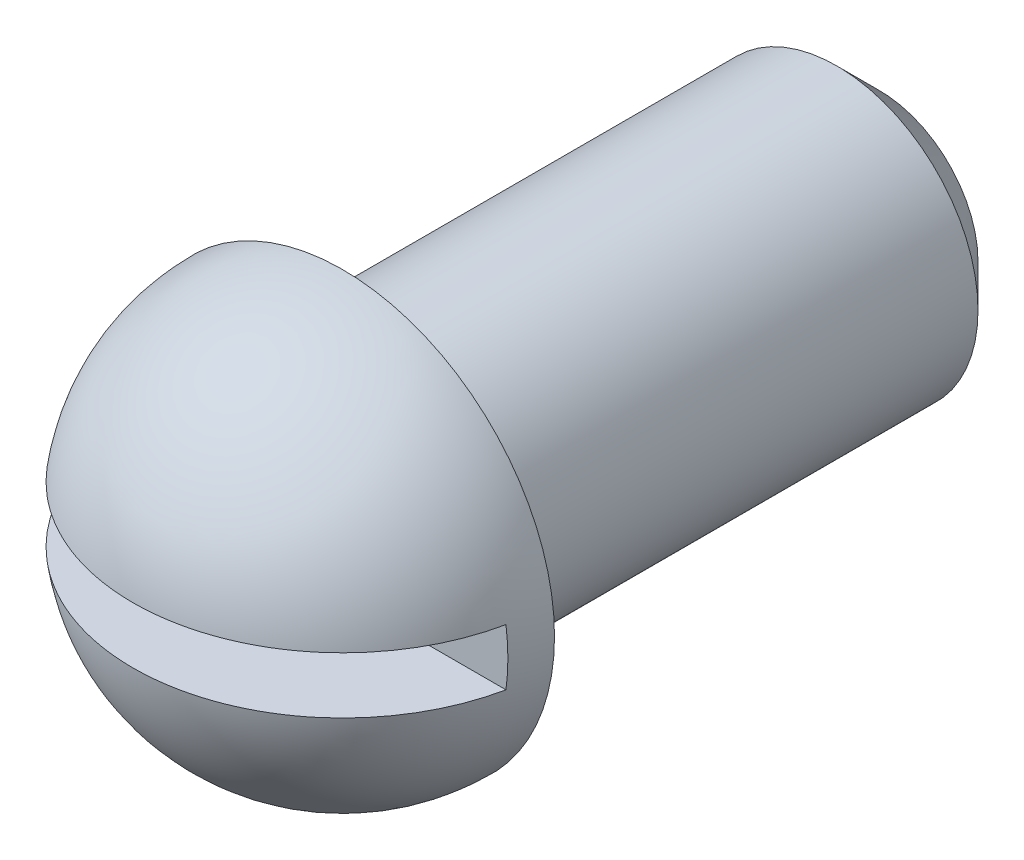
ISO-10303-21;
HEADER;
FILE_DESCRIPTION(('STEP AP214'),'2;1');
FILE_NAME('part.step','',(''),(''),'','','');
FILE_SCHEMA(('AUTOMOTIVE_DESIGN { 1 0 10303 214 1 1 1 1 }'));
ENDSEC;
DATA;
#1=APPLICATION_CONTEXT('core data for automotive mechanical design processes');
#2=APPLICATION_PROTOCOL_DEFINITION('international standard','automotive_design',2000,#1);
#3=PRODUCT_CONTEXT('',#1,'mechanical');
#4=PRODUCT('Part','Part','',(#3));
#5=PRODUCT_RELATED_PRODUCT_CATEGORY('part','',(#4));
#6=PRODUCT_DEFINITION_FORMATION('','',#4);
#7=PRODUCT_DEFINITION_CONTEXT('part definition',#1,'design');
#8=PRODUCT_DEFINITION('design','',#6,#7);
#9=PRODUCT_DEFINITION_SHAPE('','',#8);
#10=(LENGTH_UNIT() NAMED_UNIT(*) SI_UNIT(.MILLI.,.METRE.));
#11=(NAMED_UNIT(*) PLANE_ANGLE_UNIT() SI_UNIT($,.RADIAN.));
#12=(NAMED_UNIT(*) SI_UNIT($,.STERADIAN.) SOLID_ANGLE_UNIT());
#13=UNCERTAINTY_MEASURE_WITH_UNIT(LENGTH_MEASURE(1.E-05),#10,'distance_accuracy_value','');
#14=(GEOMETRIC_REPRESENTATION_CONTEXT(3) GLOBAL_UNCERTAINTY_ASSIGNED_CONTEXT((#13)) GLOBAL_UNIT_ASSIGNED_CONTEXT((#10,
#11,#12)) REPRESENTATION_CONTEXT('',''));
#15=CARTESIAN_POINT('',(0.,0.,0.));
#16=DIRECTION('',(0.,0.,1.));
#17=DIRECTION('',(1.,0.,0.));
#18=AXIS2_PLACEMENT_3D('',#15,#16,#17);
#19=CARTESIAN_POINT('',(0.,0.,-18.9999999999999));
#20=DIRECTION('',(0.,0.,1.));
#21=DIRECTION('',(1.,0.,0.));
#22=AXIS2_PLACEMENT_3D('',#19,#20,#21);
#23=PLANE('',#22);
#24=CARTESIAN_POINT('',(0.,0.,-18.9999999999999));
#25=DIRECTION('',(0.,0.,1.));
#26=DIRECTION('',(1.,0.,0.));
#27=AXIS2_PLACEMENT_3D('',#24,#25,#26);
#28=CIRCLE('',#27,7.00000000000001);
#29=CARTESIAN_POINT('',(7.00000000000002,0.,-18.9999999999999));
#30=VERTEX_POINT('',#29);
#31=EDGE_CURVE('E11',#30,#30,#28,.F.);
#32=ORIENTED_EDGE('',*,*,#31,.T.);
#33=EDGE_LOOP('',(#32));
#34=FACE_BOUND('',#33,.T.);
#35=ADVANCED_FACE('F44',(#34),#23,.F.);
#36=CARTESIAN_POINT('',(0.,2.22044604925031E-13,27.2853185595567));
#37=DIRECTION('',(0.,0.,1.));
#38=DIRECTION('',(1.,0.,0.));
#39=AXIS2_PLACEMENT_3D('',#36,#37,#38);
#40=CYLINDRICAL_SURFACE('',#39,10.);
#41=CARTESIAN_POINT('',(0.,0.,-16.));
#42=DIRECTION('',(0.,0.,1.));
#43=DIRECTION('',(1.,0.,0.));
#44=AXIS2_PLACEMENT_3D('',#41,#42,#43);
#45=CIRCLE('',#44,10.);
#46=CARTESIAN_POINT('',(10.,0.,-16.));
#47=VERTEX_POINT('',#46);
#48=EDGE_CURVE('E54',#47,#47,#45,.T.);
#49=ORIENTED_EDGE('',*,*,#48,.T.);
#50=EDGE_LOOP('',(#49));
#51=FACE_BOUND('',#50,.T.);
#52=CARTESIAN_POINT('',(0.,2.22044604925031E-13,18.9999999999999));
#53=DIRECTION('',(0.,0.,1.));
#54=DIRECTION('',(1.,0.,0.));
#55=AXIS2_PLACEMENT_3D('',#52,#53,#54);
#56=CIRCLE('',#55,10.);
#57=CARTESIAN_POINT('',(10.,2.20934381900406E-13,18.9999999999999));
#58=VERTEX_POINT('',#57);
#59=EDGE_CURVE('E84',#58,#58,#56,.T.);
#60=ORIENTED_EDGE('',*,*,#59,.F.);
#61=EDGE_LOOP('',(#60));
#62=FACE_BOUND('',#61,.T.);
#63=ADVANCED_FACE('F102',(#51,#62),#40,.T.);
#64=CARTESIAN_POINT('',(0.,10.0000000000002,18.9999999999999));
#65=DIRECTION('',(0.,0.,1.));
#66=DIRECTION('',(1.,0.,0.));
#67=AXIS2_PLACEMENT_3D('',#64,#65,#66);
#68=PLANE('',#67);
#69=CARTESIAN_POINT('',(0.,2.22044604925031E-13,18.9999999999999));
#70=DIRECTION('',(0.,0.,1.));
#71=DIRECTION('',(1.,0.,0.));
#72=AXIS2_PLACEMENT_3D('',#69,#70,#71);
#73=CIRCLE('',#72,15.);
#74=CARTESIAN_POINT('',(15.,2.20379270388094E-13,18.9999999999999));
#75=VERTEX_POINT('',#74);
#76=EDGE_CURVE('E139',#75,#75,#73,.T.);
#77=ORIENTED_EDGE('',*,*,#76,.F.);
#78=EDGE_LOOP('',(#77));
#79=FACE_BOUND('',#78,.T.);
#80=ORIENTED_EDGE('',*,*,#59,.T.);
#81=EDGE_LOOP('',(#80));
#82=FACE_BOUND('',#81,.T.);
#83=ADVANCED_FACE('F124',(#79,#82),#68,.F.);
#84=CARTESIAN_POINT('',(0.,2.22044604925031E-13,18.9999999999999));
#85=DIRECTION('',(0.,0.,1.));
#86=DIRECTION('',(0.,1.,0.));
#87=AXIS2_PLACEMENT_3D('',#84,#85,#86);
#88=SPHERICAL_SURFACE('',#87,15.);
#89=CARTESIAN_POINT('',(0.,2.22044604925031E-13,22.));
#90=DIRECTION('',(0.,0.,-1.));
#91=DIRECTION('',(-1.,0.,0.));
#92=AXIS2_PLACEMENT_3D('',#89,#90,#91);
#93=CIRCLE('',#92,14.6969384566991);
#94=CARTESIAN_POINT('',(14.560219778561,2.,22.));
#95=VERTEX_POINT('',#94);
#96=CARTESIAN_POINT('',(14.560219778561,-2.,22.));
#97=VERTEX_POINT('',#96);
#98=EDGE_CURVE('E88',#95,#97,#93,.T.);
#99=ORIENTED_EDGE('',*,*,#98,.T.);
#100=CARTESIAN_POINT('',(0.,-1.99999999999978,18.9999999999999));
#101=DIRECTION('',(0.,-1.,0.));
#102=DIRECTION('',(0.,0.,-1.));
#103=AXIS2_PLACEMENT_3D('',#100,#101,#102);
#104=CIRCLE('',#103,14.8660687473185);
#105=CARTESIAN_POINT('',(-14.560219778561,-1.99999999999867,22.0000000000014));
#106=VERTEX_POINT('',#105);
#107=EDGE_CURVE('E67',#97,#106,#104,.T.);
#108=ORIENTED_EDGE('',*,*,#107,.T.);
#109=CARTESIAN_POINT('',(-14.560219778561,2.00000000000133,22.0000000000014));
#110=VERTEX_POINT('',#109);
#111=EDGE_CURVE('E83',#106,#110,#93,.T.);
#112=ORIENTED_EDGE('',*,*,#111,.T.);
#113=CARTESIAN_POINT('',(0.,2.00000000000022,18.9999999999999));
#114=DIRECTION('',(0.,1.,0.));
#115=DIRECTION('',(0.,0.,1.));
#116=AXIS2_PLACEMENT_3D('',#113,#114,#115);
#117=CIRCLE('',#116,14.8660687473185);
#118=EDGE_CURVE('E73',#110,#95,#117,.T.);
#119=ORIENTED_EDGE('',*,*,#118,.T.);
#120=EDGE_LOOP('',(#99,#108,#112,#119));
#121=FACE_BOUND('',#120,.T.);
#122=ORIENTED_EDGE('',*,*,#76,.T.);
#123=EDGE_LOOP('',(#122));
#124=FACE_BOUND('',#123,.T.);
#125=ADVANCED_FACE('F89',(#121,#124),#88,.T.);
#126=CARTESIAN_POINT('',(-14.9999999999999,2.00000000000045,22.0000000000014));
#127=DIRECTION('',(0.,0.,-1.));
#128=DIRECTION('',(-1.,0.,0.));
#129=AXIS2_PLACEMENT_3D('',#126,#127,#128);
#130=PLANE('',#129);
#131=DIRECTION('',(1.,0.,0.));
#132=VECTOR('',#131,1.);
#133=CARTESIAN_POINT('',(-14.9999999999999,2.00000000000045,22.0000000000014));
#134=LINE('',#133,#132);
#135=EDGE_CURVE('E62',#110,#95,#134,.T.);
#136=ORIENTED_EDGE('',*,*,#135,.F.);
#137=ORIENTED_EDGE('',*,*,#111,.F.);
#138=DIRECTION('',(1.,0.,0.));
#139=VECTOR('',#138,1.);
#140=CARTESIAN_POINT('',(-14.9999999999997,-1.99999999999956,22.0000000000014));
#141=LINE('',#140,#139);
#142=EDGE_CURVE('E86',#106,#97,#141,.T.);
#143=ORIENTED_EDGE('',*,*,#142,.T.);
#144=ORIENTED_EDGE('',*,*,#98,.F.);
#145=EDGE_LOOP('',(#136,#137,#143,#144));
#146=FACE_BOUND('',#145,.T.);
#147=ADVANCED_FACE('F81',(#146),#130,.F.);
#148=CARTESIAN_POINT('',(-15.0000000000001,-2.,46.0000000000014));
#149=DIRECTION('',(0.,-1.,0.));
#150=DIRECTION('',(0.,0.,-1.));
#151=AXIS2_PLACEMENT_3D('',#148,#149,#150);
#152=PLANE('',#151);
#153=ORIENTED_EDGE('',*,*,#142,.F.);
#154=ORIENTED_EDGE('',*,*,#107,.F.);
#155=EDGE_LOOP('',(#153,#154));
#156=FACE_BOUND('',#155,.T.);
#157=ADVANCED_FACE('F114',(#156),#152,.F.);
#158=CARTESIAN_POINT('',(-15.0000000000001,2.,46.0000000000014));
#159=DIRECTION('',(0.,1.,0.));
#160=DIRECTION('',(0.,0.,1.));
#161=AXIS2_PLACEMENT_3D('',#158,#159,#160);
#162=PLANE('',#161);
#163=ORIENTED_EDGE('',*,*,#135,.T.);
#164=ORIENTED_EDGE('',*,*,#118,.F.);
#165=EDGE_LOOP('',(#163,#164));
#166=FACE_BOUND('',#165,.T.);
#167=ADVANCED_FACE('F77',(#166),#162,.F.);
#168=CARTESIAN_POINT('',(0.,0.,-16.));
#169=DIRECTION('',(0.,0.,1.));
#170=DIRECTION('',(1.,0.,0.));
#171=AXIS2_PLACEMENT_3D('',#168,#169,#170);
#172=CONICAL_SURFACE('',#171,10.,0.785398163397449);
#173=ORIENTED_EDGE('',*,*,#31,.F.);
#174=EDGE_LOOP('',(#173));
#175=FACE_BOUND('',#174,.T.);
#176=ORIENTED_EDGE('',*,*,#48,.F.);
#177=EDGE_LOOP('',(#176));
#178=FACE_BOUND('',#177,.T.);
#179=ADVANCED_FACE('F48',(#175,#178),#172,.T.);
#180=CLOSED_SHELL('',(#35,#63,#83,#125,#147,#157,#167,#179));
#181=MANIFOLD_SOLID_BREP('B2',#180);
#182=ADVANCED_BREP_SHAPE_REPRESENTATION('',(#18,#181),#14);
#183=SHAPE_DEFINITION_REPRESENTATION(#9,#182);
ENDSEC;
END-ISO-10303-21;
